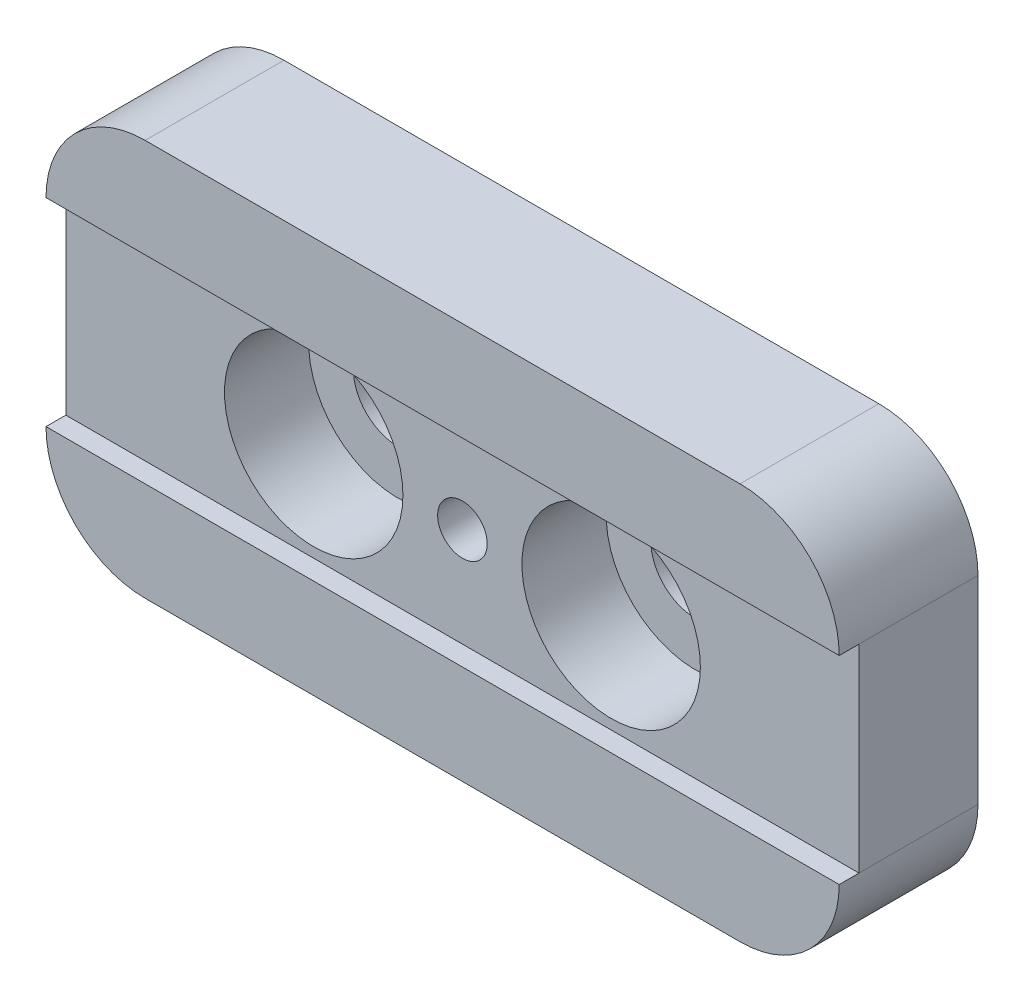
ISO-10303-21;
HEADER;
FILE_DESCRIPTION(('STEP AP214'),'2;1');
FILE_NAME('part.step','',(''),(''),'','','');
FILE_SCHEMA(('AUTOMOTIVE_DESIGN { 1 0 10303 214 1 1 1 1 }'));
ENDSEC;
DATA;
#1=APPLICATION_CONTEXT('core data for automotive mechanical design processes');
#2=APPLICATION_PROTOCOL_DEFINITION('international standard','automotive_design',2000,#1);
#3=PRODUCT_CONTEXT('',#1,'mechanical');
#4=PRODUCT('Part','Part','',(#3));
#5=PRODUCT_RELATED_PRODUCT_CATEGORY('part','',(#4));
#6=PRODUCT_DEFINITION_FORMATION('','',#4);
#7=PRODUCT_DEFINITION_CONTEXT('part definition',#1,'design');
#8=PRODUCT_DEFINITION('design','',#6,#7);
#9=PRODUCT_DEFINITION_SHAPE('','',#8);
#10=(LENGTH_UNIT() NAMED_UNIT(*) SI_UNIT(.MILLI.,.METRE.));
#11=(NAMED_UNIT(*) PLANE_ANGLE_UNIT() SI_UNIT($,.RADIAN.));
#12=(NAMED_UNIT(*) SI_UNIT($,.STERADIAN.) SOLID_ANGLE_UNIT());
#13=UNCERTAINTY_MEASURE_WITH_UNIT(LENGTH_MEASURE(1.E-05),#10,'distance_accuracy_value','');
#14=(GEOMETRIC_REPRESENTATION_CONTEXT(3) GLOBAL_UNCERTAINTY_ASSIGNED_CONTEXT((#13)) GLOBAL_UNIT_ASSIGNED_CONTEXT((#10,
#11,#12)) REPRESENTATION_CONTEXT('',''));
#15=CARTESIAN_POINT('',(0.,0.,0.));
#16=DIRECTION('',(0.,0.,1.));
#17=DIRECTION('',(1.,0.,0.));
#18=AXIS2_PLACEMENT_3D('',#15,#16,#17);
#19=CARTESIAN_POINT('',(40.,20.,14.));
#20=DIRECTION('',(0.,0.,-1.));
#21=DIRECTION('',(-1.,0.,0.));
#22=AXIS2_PLACEMENT_3D('',#19,#20,#21);
#23=PLANE('',#22);
#24=DIRECTION('',(1.,0.,0.));
#25=VECTOR('',#24,1.);
#26=CARTESIAN_POINT('',(-40.,-20.,14.));
#27=LINE('',#26,#25);
#28=CARTESIAN_POINT('',(-30.,-20.,14.));
#29=VERTEX_POINT('',#28);
#30=CARTESIAN_POINT('',(30.,-20.,14.));
#31=VERTEX_POINT('',#30);
#32=EDGE_CURVE('E158',#29,#31,#27,.T.);
#33=ORIENTED_EDGE('',*,*,#32,.T.);
#34=CARTESIAN_POINT('',(30.,-10.,14.));
#35=DIRECTION('',(0.,0.,-1.));
#36=DIRECTION('',(-1.,0.,0.));
#37=AXIS2_PLACEMENT_3D('',#34,#35,#36);
#38=CIRCLE('',#37,10.);
#39=CARTESIAN_POINT('',(40.,-10.,14.));
#40=VERTEX_POINT('',#39);
#41=EDGE_CURVE('E11',#31,#40,#38,.F.);
#42=ORIENTED_EDGE('',*,*,#41,.T.);
#43=DIRECTION('',(1.,0.,0.));
#44=VECTOR('',#43,1.);
#45=CARTESIAN_POINT('',(-40.,-10.,14.));
#46=LINE('',#45,#44);
#47=CARTESIAN_POINT('',(-40.,-10.,14.));
#48=VERTEX_POINT('',#47);
#49=EDGE_CURVE('E143',#48,#40,#46,.T.);
#50=ORIENTED_EDGE('',*,*,#49,.F.);
#51=CARTESIAN_POINT('',(-30.,-10.,14.));
#52=DIRECTION('',(0.,0.,-1.));
#53=DIRECTION('',(-1.,0.,0.));
#54=AXIS2_PLACEMENT_3D('',#51,#52,#53);
#55=CIRCLE('',#54,10.);
#56=EDGE_CURVE('E42',#48,#29,#55,.F.);
#57=ORIENTED_EDGE('',*,*,#56,.T.);
#58=EDGE_LOOP('',(#33,#42,#50,#57));
#59=FACE_BOUND('',#58,.T.);
#60=ADVANCED_FACE('F34',(#59),#23,.F.);
#61=CARTESIAN_POINT('',(40.,-20.,14.));
#62=DIRECTION('',(-1.,0.,0.));
#63=DIRECTION('',(0.,0.,1.));
#64=AXIS2_PLACEMENT_3D('',#61,#62,#63);
#65=PLANE('',#64);
#66=DIRECTION('',(0.,1.,0.));
#67=VECTOR('',#66,1.);
#68=CARTESIAN_POINT('',(40.,-20.,0.));
#69=LINE('',#68,#67);
#70=CARTESIAN_POINT('',(40.,-10.,0.));
#71=VERTEX_POINT('',#70);
#72=CARTESIAN_POINT('',(40.,9.99999999999999,0.));
#73=VERTEX_POINT('',#72);
#74=EDGE_CURVE('E118',#71,#73,#69,.T.);
#75=ORIENTED_EDGE('',*,*,#74,.T.);
#76=DIRECTION('',(0.,0.,-1.));
#77=VECTOR('',#76,1.);
#78=CARTESIAN_POINT('',(40.,9.99999999999999,14.));
#79=LINE('',#78,#77);
#80=CARTESIAN_POINT('',(40.,10.,12.));
#81=VERTEX_POINT('',#80);
#82=EDGE_CURVE('E112',#73,#81,#79,.F.);
#83=ORIENTED_EDGE('',*,*,#82,.T.);
#84=DIRECTION('',(0.,1.,0.));
#85=VECTOR('',#84,1.);
#86=CARTESIAN_POINT('',(40.,-10.,12.));
#87=LINE('',#86,#85);
#88=CARTESIAN_POINT('',(40.,-10.,12.));
#89=VERTEX_POINT('',#88);
#90=EDGE_CURVE('E116',#89,#81,#87,.T.);
#91=ORIENTED_EDGE('',*,*,#90,.F.);
#92=DIRECTION('',(0.,0.,-1.));
#93=VECTOR('',#92,1.);
#94=CARTESIAN_POINT('',(40.,-10.,14.));
#95=LINE('',#94,#93);
#96=EDGE_CURVE('E122',#89,#71,#95,.T.);
#97=ORIENTED_EDGE('',*,*,#96,.T.);
#98=EDGE_LOOP('',(#75,#83,#91,#97));
#99=FACE_BOUND('',#98,.T.);
#100=ADVANCED_FACE('F114',(#99),#65,.F.);
#101=CARTESIAN_POINT('',(-40.,20.,14.));
#102=DIRECTION('',(0.,-1.,0.));
#103=DIRECTION('',(0.,0.,-1.));
#104=AXIS2_PLACEMENT_3D('',#101,#102,#103);
#105=PLANE('',#104);
#106=DIRECTION('',(-1.,0.,0.));
#107=VECTOR('',#106,1.);
#108=CARTESIAN_POINT('',(-40.,20.,0.));
#109=LINE('',#108,#107);
#110=CARTESIAN_POINT('',(30.,20.,0.));
#111=VERTEX_POINT('',#110);
#112=CARTESIAN_POINT('',(-30.,20.,0.));
#113=VERTEX_POINT('',#112);
#114=EDGE_CURVE('E163',#111,#113,#109,.T.);
#115=ORIENTED_EDGE('',*,*,#114,.T.);
#116=DIRECTION('',(0.,0.,-1.));
#117=VECTOR('',#116,1.);
#118=CARTESIAN_POINT('',(-30.,20.,14.));
#119=LINE('',#118,#117);
#120=CARTESIAN_POINT('',(-30.,20.,14.));
#121=VERTEX_POINT('',#120);
#122=EDGE_CURVE('E185',#113,#121,#119,.F.);
#123=ORIENTED_EDGE('',*,*,#122,.T.);
#124=DIRECTION('',(-1.,0.,0.));
#125=VECTOR('',#124,1.);
#126=CARTESIAN_POINT('',(-40.,20.,14.));
#127=LINE('',#126,#125);
#128=CARTESIAN_POINT('',(30.,20.,14.));
#129=VERTEX_POINT('',#128);
#130=EDGE_CURVE('E155',#129,#121,#127,.T.);
#131=ORIENTED_EDGE('',*,*,#130,.F.);
#132=DIRECTION('',(0.,0.,-1.));
#133=VECTOR('',#132,1.);
#134=CARTESIAN_POINT('',(30.,20.,14.));
#135=LINE('',#134,#133);
#136=EDGE_CURVE('E182',#129,#111,#135,.T.);
#137=ORIENTED_EDGE('',*,*,#136,.T.);
#138=EDGE_LOOP('',(#115,#123,#131,#137));
#139=FACE_BOUND('',#138,.T.);
#140=ADVANCED_FACE('F273',(#139),#105,.F.);
#141=CARTESIAN_POINT('',(-40.,-20.,14.));
#142=DIRECTION('',(1.,0.,0.));
#143=DIRECTION('',(0.,0.,-1.));
#144=AXIS2_PLACEMENT_3D('',#141,#142,#143);
#145=PLANE('',#144);
#146=DIRECTION('',(0.,-1.,0.));
#147=VECTOR('',#146,1.);
#148=CARTESIAN_POINT('',(-40.,-10.,12.));
#149=LINE('',#148,#147);
#150=CARTESIAN_POINT('',(-40.,10.,12.));
#151=VERTEX_POINT('',#150);
#152=CARTESIAN_POINT('',(-40.,-10.,12.));
#153=VERTEX_POINT('',#152);
#154=EDGE_CURVE('E137',#151,#153,#149,.T.);
#155=ORIENTED_EDGE('',*,*,#154,.F.);
#156=DIRECTION('',(0.,0.,-1.));
#157=VECTOR('',#156,1.);
#158=CARTESIAN_POINT('',(-40.,9.99999999999999,14.));
#159=LINE('',#158,#157);
#160=CARTESIAN_POINT('',(-40.,9.99999999999999,0.));
#161=VERTEX_POINT('',#160);
#162=EDGE_CURVE('E172',#151,#161,#159,.T.);
#163=ORIENTED_EDGE('',*,*,#162,.T.);
#164=DIRECTION('',(0.,-1.,0.));
#165=VECTOR('',#164,1.);
#166=CARTESIAN_POINT('',(-40.,-20.,0.));
#167=LINE('',#166,#165);
#168=CARTESIAN_POINT('',(-40.,-10.,0.));
#169=VERTEX_POINT('',#168);
#170=EDGE_CURVE('E167',#161,#169,#167,.T.);
#171=ORIENTED_EDGE('',*,*,#170,.T.);
#172=DIRECTION('',(0.,0.,-1.));
#173=VECTOR('',#172,1.);
#174=CARTESIAN_POINT('',(-40.,-10.,14.));
#175=LINE('',#174,#173);
#176=EDGE_CURVE('E161',#169,#153,#175,.F.);
#177=ORIENTED_EDGE('',*,*,#176,.T.);
#178=EDGE_LOOP('',(#155,#163,#171,#177));
#179=FACE_BOUND('',#178,.T.);
#180=ADVANCED_FACE('F284',(#179),#145,.F.);
#181=CARTESIAN_POINT('',(-40.,-20.,14.));
#182=DIRECTION('',(0.,1.,0.));
#183=DIRECTION('',(0.,0.,1.));
#184=AXIS2_PLACEMENT_3D('',#181,#182,#183);
#185=PLANE('',#184);
#186=DIRECTION('',(1.,0.,0.));
#187=VECTOR('',#186,1.);
#188=CARTESIAN_POINT('',(-40.,-20.,0.));
#189=LINE('',#188,#187);
#190=CARTESIAN_POINT('',(-30.,-20.,0.));
#191=VERTEX_POINT('',#190);
#192=CARTESIAN_POINT('',(30.,-20.,0.));
#193=VERTEX_POINT('',#192);
#194=EDGE_CURVE('E159',#191,#193,#189,.T.);
#195=ORIENTED_EDGE('',*,*,#194,.T.);
#196=DIRECTION('',(0.,0.,-1.));
#197=VECTOR('',#196,1.);
#198=CARTESIAN_POINT('',(30.,-20.,14.));
#199=LINE('',#198,#197);
#200=EDGE_CURVE('E49',#193,#31,#199,.F.);
#201=ORIENTED_EDGE('',*,*,#200,.T.);
#202=ORIENTED_EDGE('',*,*,#32,.F.);
#203=DIRECTION('',(0.,0.,-1.));
#204=VECTOR('',#203,1.);
#205=CARTESIAN_POINT('',(-30.,-20.,14.));
#206=LINE('',#205,#204);
#207=EDGE_CURVE('E121',#29,#191,#206,.T.);
#208=ORIENTED_EDGE('',*,*,#207,.T.);
#209=EDGE_LOOP('',(#195,#201,#202,#208));
#210=FACE_BOUND('',#209,.T.);
#211=ADVANCED_FACE('F195',(#210),#185,.F.);
#212=ORIENTED_EDGE('',*,*,#130,.T.);
#213=CARTESIAN_POINT('',(-30.,9.99999999999999,14.));
#214=DIRECTION('',(0.,0.,-1.));
#215=DIRECTION('',(-1.,0.,0.));
#216=AXIS2_PLACEMENT_3D('',#213,#214,#215);
#217=CIRCLE('',#216,10.);
#218=CARTESIAN_POINT('',(-40.,10.,14.));
#219=VERTEX_POINT('',#218);
#220=EDGE_CURVE('E188',#121,#219,#217,.F.);
#221=ORIENTED_EDGE('',*,*,#220,.T.);
#222=DIRECTION('',(-1.,0.,0.));
#223=VECTOR('',#222,1.);
#224=CARTESIAN_POINT('',(-40.,10.,14.));
#225=LINE('',#224,#223);
#226=CARTESIAN_POINT('',(40.,10.,14.));
#227=VERTEX_POINT('',#226);
#228=EDGE_CURVE('E210',#227,#219,#225,.T.);
#229=ORIENTED_EDGE('',*,*,#228,.F.);
#230=CARTESIAN_POINT('',(30.,9.99999999999999,14.));
#231=DIRECTION('',(0.,0.,-1.));
#232=DIRECTION('',(-1.,0.,0.));
#233=AXIS2_PLACEMENT_3D('',#230,#231,#232);
#234=CIRCLE('',#233,10.);
#235=EDGE_CURVE('E148',#227,#129,#234,.F.);
#236=ORIENTED_EDGE('',*,*,#235,.T.);
#237=EDGE_LOOP('',(#212,#221,#229,#236));
#238=FACE_BOUND('',#237,.T.);
#239=ADVANCED_FACE('F269',(#238),#23,.F.);
#240=CARTESIAN_POINT('',(40.,20.,0.));
#241=DIRECTION('',(0.,0.,-1.));
#242=DIRECTION('',(-1.,0.,0.));
#243=AXIS2_PLACEMENT_3D('',#240,#241,#242);
#244=PLANE('',#243);
#245=CARTESIAN_POINT('',(-15.,0.,-4.52762827229947E-13));
#246=DIRECTION('',(0.,0.,1.));
#247=DIRECTION('',(1.,0.,0.));
#248=AXIS2_PLACEMENT_3D('',#245,#246,#247);
#249=CIRCLE('',#248,4.5);
#250=CARTESIAN_POINT('',(-10.5,0.,-4.52762827229947E-13));
#251=VERTEX_POINT('',#250);
#252=EDGE_CURVE('E234',#251,#251,#249,.T.);
#253=ORIENTED_EDGE('',*,*,#252,.T.);
#254=EDGE_LOOP('',(#253));
#255=FACE_BOUND('',#254,.T.);
#256=CARTESIAN_POINT('',(15.,0.,-4.52762827229947E-13));
#257=DIRECTION('',(0.,0.,1.));
#258=DIRECTION('',(1.,0.,0.));
#259=AXIS2_PLACEMENT_3D('',#256,#257,#258);
#260=CIRCLE('',#259,4.5);
#261=CARTESIAN_POINT('',(19.5,0.,-4.52762827229947E-13));
#262=VERTEX_POINT('',#261);
#263=EDGE_CURVE('E222',#262,#262,#260,.T.);
#264=ORIENTED_EDGE('',*,*,#263,.T.);
#265=EDGE_LOOP('',(#264));
#266=FACE_BOUND('',#265,.T.);
#267=CARTESIAN_POINT('',(0.,0.,0.));
#268=DIRECTION('',(0.,0.,-1.));
#269=DIRECTION('',(-1.,0.,0.));
#270=AXIS2_PLACEMENT_3D('',#267,#268,#269);
#271=CIRCLE('',#270,2.5);
#272=CARTESIAN_POINT('',(-2.5,0.,0.));
#273=VERTEX_POINT('',#272);
#274=EDGE_CURVE('E212',#273,#273,#271,.T.);
#275=ORIENTED_EDGE('',*,*,#274,.F.);
#276=EDGE_LOOP('',(#275));
#277=FACE_BOUND('',#276,.T.);
#278=ORIENTED_EDGE('',*,*,#170,.F.);
#279=CARTESIAN_POINT('',(-30.,9.99999999999999,0.));
#280=DIRECTION('',(0.,0.,-1.));
#281=DIRECTION('',(-1.,0.,0.));
#282=AXIS2_PLACEMENT_3D('',#279,#280,#281);
#283=CIRCLE('',#282,10.);
#284=EDGE_CURVE('E180',#161,#113,#283,.T.);
#285=ORIENTED_EDGE('',*,*,#284,.T.);
#286=ORIENTED_EDGE('',*,*,#114,.F.);
#287=CARTESIAN_POINT('',(30.,9.99999999999999,0.));
#288=DIRECTION('',(0.,0.,-1.));
#289=DIRECTION('',(-1.,0.,0.));
#290=AXIS2_PLACEMENT_3D('',#287,#288,#289);
#291=CIRCLE('',#290,10.);
#292=EDGE_CURVE('E178',#111,#73,#291,.T.);
#293=ORIENTED_EDGE('',*,*,#292,.T.);
#294=ORIENTED_EDGE('',*,*,#74,.F.);
#295=CARTESIAN_POINT('',(30.,-10.,0.));
#296=DIRECTION('',(0.,0.,-1.));
#297=DIRECTION('',(-1.,0.,0.));
#298=AXIS2_PLACEMENT_3D('',#295,#296,#297);
#299=CIRCLE('',#298,10.);
#300=EDGE_CURVE('E176',#71,#193,#299,.T.);
#301=ORIENTED_EDGE('',*,*,#300,.T.);
#302=ORIENTED_EDGE('',*,*,#194,.F.);
#303=CARTESIAN_POINT('',(-30.,-10.,0.));
#304=DIRECTION('',(0.,0.,-1.));
#305=DIRECTION('',(-1.,0.,0.));
#306=AXIS2_PLACEMENT_3D('',#303,#304,#305);
#307=CIRCLE('',#306,10.);
#308=EDGE_CURVE('E174',#191,#169,#307,.T.);
#309=ORIENTED_EDGE('',*,*,#308,.T.);
#310=EDGE_LOOP('',(#278,#285,#286,#293,#294,#301,#302,#309));
#311=FACE_BOUND('',#310,.T.);
#312=ADVANCED_FACE('F199',(#255,#266,#277,#311),#244,.T.);
#313=CARTESIAN_POINT('',(-40.,-10.,12.));
#314=DIRECTION('',(0.,-1.,0.));
#315=DIRECTION('',(0.,0.,-1.));
#316=AXIS2_PLACEMENT_3D('',#313,#314,#315);
#317=PLANE('',#316);
#318=ORIENTED_EDGE('',*,*,#49,.T.);
#319=DIRECTION('',(0.,0.,1.));
#320=VECTOR('',#319,1.);
#321=CARTESIAN_POINT('',(40.,-10.,12.));
#322=LINE('',#321,#320);
#323=EDGE_CURVE('E164',#89,#40,#322,.T.);
#324=ORIENTED_EDGE('',*,*,#323,.F.);
#325=DIRECTION('',(1.,0.,0.));
#326=VECTOR('',#325,1.);
#327=CARTESIAN_POINT('',(-40.,-10.,12.));
#328=LINE('',#327,#326);
#329=EDGE_CURVE('E142',#153,#89,#328,.T.);
#330=ORIENTED_EDGE('',*,*,#329,.F.);
#331=DIRECTION('',(0.,0.,1.));
#332=VECTOR('',#331,1.);
#333=CARTESIAN_POINT('',(-40.,-10.,12.));
#334=LINE('',#333,#332);
#335=EDGE_CURVE('E150',#153,#48,#334,.T.);
#336=ORIENTED_EDGE('',*,*,#335,.T.);
#337=EDGE_LOOP('',(#318,#324,#330,#336));
#338=FACE_BOUND('',#337,.T.);
#339=ADVANCED_FACE('F208',(#338),#317,.F.);
#340=CARTESIAN_POINT('',(-40.,10.,12.));
#341=DIRECTION('',(0.,1.,0.));
#342=DIRECTION('',(0.,0.,1.));
#343=AXIS2_PLACEMENT_3D('',#340,#341,#342);
#344=PLANE('',#343);
#345=ORIENTED_EDGE('',*,*,#228,.T.);
#346=DIRECTION('',(0.,0.,1.));
#347=VECTOR('',#346,1.);
#348=CARTESIAN_POINT('',(-40.,10.,12.));
#349=LINE('',#348,#347);
#350=EDGE_CURVE('E133',#151,#219,#349,.T.);
#351=ORIENTED_EDGE('',*,*,#350,.F.);
#352=DIRECTION('',(-1.,0.,0.));
#353=VECTOR('',#352,1.);
#354=CARTESIAN_POINT('',(-40.,10.,12.));
#355=LINE('',#354,#353);
#356=EDGE_CURVE('E127',#81,#151,#355,.T.);
#357=ORIENTED_EDGE('',*,*,#356,.F.);
#358=DIRECTION('',(0.,0.,1.));
#359=VECTOR('',#358,1.);
#360=CARTESIAN_POINT('',(40.,10.,12.));
#361=LINE('',#360,#359);
#362=EDGE_CURVE('E130',#81,#227,#361,.T.);
#363=ORIENTED_EDGE('',*,*,#362,.T.);
#364=EDGE_LOOP('',(#345,#351,#357,#363));
#365=FACE_BOUND('',#364,.T.);
#366=ADVANCED_FACE('F129',(#365),#344,.F.);
#367=CARTESIAN_POINT('',(40.,10.,12.));
#368=DIRECTION('',(0.,0.,-1.));
#369=DIRECTION('',(-1.,0.,0.));
#370=AXIS2_PLACEMENT_3D('',#367,#368,#369);
#371=PLANE('',#370);
#372=CARTESIAN_POINT('',(-15.,0.,12.));
#373=DIRECTION('',(0.,0.,1.));
#374=DIRECTION('',(1.,0.,0.));
#375=AXIS2_PLACEMENT_3D('',#372,#373,#374);
#376=CIRCLE('',#375,9.);
#377=CARTESIAN_POINT('',(-6.,0.,12.));
#378=VERTEX_POINT('',#377);
#379=EDGE_CURVE('E243',#378,#378,#376,.T.);
#380=ORIENTED_EDGE('',*,*,#379,.F.);
#381=EDGE_LOOP('',(#380));
#382=FACE_BOUND('',#381,.T.);
#383=CARTESIAN_POINT('',(15.,0.,12.));
#384=DIRECTION('',(0.,0.,1.));
#385=DIRECTION('',(1.,0.,0.));
#386=AXIS2_PLACEMENT_3D('',#383,#384,#385);
#387=CIRCLE('',#386,9.);
#388=CARTESIAN_POINT('',(24.,0.,12.));
#389=VERTEX_POINT('',#388);
#390=EDGE_CURVE('E231',#389,#389,#387,.T.);
#391=ORIENTED_EDGE('',*,*,#390,.F.);
#392=EDGE_LOOP('',(#391));
#393=FACE_BOUND('',#392,.T.);
#394=CARTESIAN_POINT('',(0.,0.,12.));
#395=DIRECTION('',(0.,0.,1.));
#396=DIRECTION('',(1.,0.,0.));
#397=AXIS2_PLACEMENT_3D('',#394,#395,#396);
#398=CIRCLE('',#397,2.5);
#399=CARTESIAN_POINT('',(2.5,0.,12.));
#400=VERTEX_POINT('',#399);
#401=EDGE_CURVE('E219',#400,#400,#398,.T.);
#402=ORIENTED_EDGE('',*,*,#401,.F.);
#403=EDGE_LOOP('',(#402));
#404=FACE_BOUND('',#403,.T.);
#405=ORIENTED_EDGE('',*,*,#90,.T.);
#406=ORIENTED_EDGE('',*,*,#356,.T.);
#407=ORIENTED_EDGE('',*,*,#154,.T.);
#408=ORIENTED_EDGE('',*,*,#329,.T.);
#409=EDGE_LOOP('',(#405,#406,#407,#408));
#410=FACE_BOUND('',#409,.T.);
#411=ADVANCED_FACE('F140',(#382,#393,#404,#410),#371,.F.);
#412=CARTESIAN_POINT('',(0.,0.,12.));
#413=DIRECTION('',(0.,0.,1.));
#414=DIRECTION('',(1.,0.,0.));
#415=AXIS2_PLACEMENT_3D('',#412,#413,#414);
#416=CYLINDRICAL_SURFACE('',#415,2.5);
#417=ORIENTED_EDGE('',*,*,#274,.T.);
#418=EDGE_LOOP('',(#417));
#419=FACE_BOUND('',#418,.T.);
#420=ORIENTED_EDGE('',*,*,#401,.T.);
#421=EDGE_LOOP('',(#420));
#422=FACE_BOUND('',#421,.T.);
#423=ADVANCED_FACE('F251',(#419,#422),#416,.F.);
#424=CARTESIAN_POINT('',(15.,0.,12.));
#425=DIRECTION('',(0.,0.,1.));
#426=DIRECTION('',(1.,0.,0.));
#427=AXIS2_PLACEMENT_3D('',#424,#425,#426);
#428=CYLINDRICAL_SURFACE('',#427,4.5);
#429=ORIENTED_EDGE('',*,*,#263,.F.);
#430=EDGE_LOOP('',(#429));
#431=FACE_BOUND('',#430,.T.);
#432=CARTESIAN_POINT('',(15.,0.,3.5));
#433=DIRECTION('',(0.,0.,1.));
#434=DIRECTION('',(1.,0.,0.));
#435=AXIS2_PLACEMENT_3D('',#432,#433,#434);
#436=CIRCLE('',#435,4.5);
#437=CARTESIAN_POINT('',(19.5,0.,3.5));
#438=VERTEX_POINT('',#437);
#439=EDGE_CURVE('E225',#438,#438,#436,.T.);
#440=ORIENTED_EDGE('',*,*,#439,.T.);
#441=EDGE_LOOP('',(#440));
#442=FACE_BOUND('',#441,.T.);
#443=ADVANCED_FACE('F258',(#431,#442),#428,.F.);
#444=CARTESIAN_POINT('',(19.5,0.,3.5));
#445=DIRECTION('',(0.,0.,-1.));
#446=DIRECTION('',(-1.,0.,0.));
#447=AXIS2_PLACEMENT_3D('',#444,#445,#446);
#448=PLANE('',#447);
#449=ORIENTED_EDGE('',*,*,#439,.F.);
#450=EDGE_LOOP('',(#449));
#451=FACE_BOUND('',#450,.T.);
#452=CARTESIAN_POINT('',(15.,0.,3.5));
#453=DIRECTION('',(0.,0.,1.));
#454=DIRECTION('',(1.,0.,0.));
#455=AXIS2_PLACEMENT_3D('',#452,#453,#454);
#456=CIRCLE('',#455,9.);
#457=CARTESIAN_POINT('',(24.,0.,3.5));
#458=VERTEX_POINT('',#457);
#459=EDGE_CURVE('E228',#458,#458,#456,.T.);
#460=ORIENTED_EDGE('',*,*,#459,.T.);
#461=EDGE_LOOP('',(#460));
#462=FACE_BOUND('',#461,.T.);
#463=ADVANCED_FACE('F264',(#451,#462),#448,.F.);
#464=CARTESIAN_POINT('',(15.,0.,12.));
#465=DIRECTION('',(0.,0.,1.));
#466=DIRECTION('',(1.,0.,0.));
#467=AXIS2_PLACEMENT_3D('',#464,#465,#466);
#468=CYLINDRICAL_SURFACE('',#467,9.);
#469=ORIENTED_EDGE('',*,*,#459,.F.);
#470=EDGE_LOOP('',(#469));
#471=FACE_BOUND('',#470,.T.);
#472=ORIENTED_EDGE('',*,*,#390,.T.);
#473=EDGE_LOOP('',(#472));
#474=FACE_BOUND('',#473,.T.);
#475=ADVANCED_FACE('F415',(#471,#474),#468,.F.);
#476=CARTESIAN_POINT('',(-15.,0.,12.));
#477=DIRECTION('',(0.,0.,1.));
#478=DIRECTION('',(1.,0.,0.));
#479=AXIS2_PLACEMENT_3D('',#476,#477,#478);
#480=CYLINDRICAL_SURFACE('',#479,4.5);
#481=ORIENTED_EDGE('',*,*,#252,.F.);
#482=EDGE_LOOP('',(#481));
#483=FACE_BOUND('',#482,.T.);
#484=CARTESIAN_POINT('',(-15.,0.,3.5));
#485=DIRECTION('',(0.,0.,1.));
#486=DIRECTION('',(1.,0.,0.));
#487=AXIS2_PLACEMENT_3D('',#484,#485,#486);
#488=CIRCLE('',#487,4.5);
#489=CARTESIAN_POINT('',(-10.5,0.,3.5));
#490=VERTEX_POINT('',#489);
#491=EDGE_CURVE('E237',#490,#490,#488,.T.);
#492=ORIENTED_EDGE('',*,*,#491,.T.);
#493=EDGE_LOOP('',(#492));
#494=FACE_BOUND('',#493,.T.);
#495=ADVANCED_FACE('F405',(#483,#494),#480,.F.);
#496=CARTESIAN_POINT('',(-10.5,0.,3.5));
#497=DIRECTION('',(0.,0.,-1.));
#498=DIRECTION('',(-1.,0.,0.));
#499=AXIS2_PLACEMENT_3D('',#496,#497,#498);
#500=PLANE('',#499);
#501=ORIENTED_EDGE('',*,*,#491,.F.);
#502=EDGE_LOOP('',(#501));
#503=FACE_BOUND('',#502,.T.);
#504=CARTESIAN_POINT('',(-15.,0.,3.5));
#505=DIRECTION('',(0.,0.,1.));
#506=DIRECTION('',(1.,0.,0.));
#507=AXIS2_PLACEMENT_3D('',#504,#505,#506);
#508=CIRCLE('',#507,9.);
#509=CARTESIAN_POINT('',(-6.,0.,3.5));
#510=VERTEX_POINT('',#509);
#511=EDGE_CURVE('E240',#510,#510,#508,.T.);
#512=ORIENTED_EDGE('',*,*,#511,.T.);
#513=EDGE_LOOP('',(#512));
#514=FACE_BOUND('',#513,.T.);
#515=ADVANCED_FACE('F395',(#503,#514),#500,.F.);
#516=CARTESIAN_POINT('',(-15.,0.,12.));
#517=DIRECTION('',(0.,0.,1.));
#518=DIRECTION('',(1.,0.,0.));
#519=AXIS2_PLACEMENT_3D('',#516,#517,#518);
#520=CYLINDRICAL_SURFACE('',#519,9.);
#521=ORIENTED_EDGE('',*,*,#511,.F.);
#522=EDGE_LOOP('',(#521));
#523=FACE_BOUND('',#522,.T.);
#524=ORIENTED_EDGE('',*,*,#379,.T.);
#525=EDGE_LOOP('',(#524));
#526=FACE_BOUND('',#525,.T.);
#527=ADVANCED_FACE('F247',(#523,#526),#520,.F.);
#528=CARTESIAN_POINT('',(-30.,9.99999999999999,14.));
#529=DIRECTION('',(0.,0.,-1.));
#530=DIRECTION('',(-1.,0.,0.));
#531=AXIS2_PLACEMENT_3D('',#528,#529,#530);
#532=CYLINDRICAL_SURFACE('',#531,10.);
#533=ORIENTED_EDGE('',*,*,#220,.F.);
#534=ORIENTED_EDGE('',*,*,#122,.F.);
#535=ORIENTED_EDGE('',*,*,#284,.F.);
#536=ORIENTED_EDGE('',*,*,#162,.F.);
#537=ORIENTED_EDGE('',*,*,#350,.T.);
#538=EDGE_LOOP('',(#533,#534,#535,#536,#537));
#539=FACE_BOUND('',#538,.T.);
#540=ADVANCED_FACE('F291',(#539),#532,.T.);
#541=CARTESIAN_POINT('',(30.,9.99999999999999,14.));
#542=DIRECTION('',(0.,0.,-1.));
#543=DIRECTION('',(-1.,0.,0.));
#544=AXIS2_PLACEMENT_3D('',#541,#542,#543);
#545=CYLINDRICAL_SURFACE('',#544,10.);
#546=ORIENTED_EDGE('',*,*,#362,.F.);
#547=ORIENTED_EDGE('',*,*,#82,.F.);
#548=ORIENTED_EDGE('',*,*,#292,.F.);
#549=ORIENTED_EDGE('',*,*,#136,.F.);
#550=ORIENTED_EDGE('',*,*,#235,.F.);
#551=EDGE_LOOP('',(#546,#547,#548,#549,#550));
#552=FACE_BOUND('',#551,.T.);
#553=ADVANCED_FACE('F146',(#552),#545,.T.);
#554=CARTESIAN_POINT('',(30.,-10.,14.));
#555=DIRECTION('',(0.,0.,-1.));
#556=DIRECTION('',(-1.,0.,0.));
#557=AXIS2_PLACEMENT_3D('',#554,#555,#556);
#558=CYLINDRICAL_SURFACE('',#557,10.);
#559=ORIENTED_EDGE('',*,*,#41,.F.);
#560=ORIENTED_EDGE('',*,*,#200,.F.);
#561=ORIENTED_EDGE('',*,*,#300,.F.);
#562=ORIENTED_EDGE('',*,*,#96,.F.);
#563=ORIENTED_EDGE('',*,*,#323,.T.);
#564=EDGE_LOOP('',(#559,#560,#561,#562,#563));
#565=FACE_BOUND('',#564,.T.);
#566=ADVANCED_FACE('F203',(#565),#558,.T.);
#567=CARTESIAN_POINT('',(-30.,-10.,14.));
#568=DIRECTION('',(0.,0.,-1.));
#569=DIRECTION('',(-1.,0.,0.));
#570=AXIS2_PLACEMENT_3D('',#567,#568,#569);
#571=CYLINDRICAL_SURFACE('',#570,10.);
#572=ORIENTED_EDGE('',*,*,#335,.F.);
#573=ORIENTED_EDGE('',*,*,#176,.F.);
#574=ORIENTED_EDGE('',*,*,#308,.F.);
#575=ORIENTED_EDGE('',*,*,#207,.F.);
#576=ORIENTED_EDGE('',*,*,#56,.F.);
#577=EDGE_LOOP('',(#572,#573,#574,#575,#576));
#578=FACE_BOUND('',#577,.T.);
#579=ADVANCED_FACE('F36',(#578),#571,.T.);
#580=CLOSED_SHELL('',(#60,#100,#140,#180,#211,#239,#312,#339,#366,#411,#423,#443,#463,#475,#495,
#515,#527,#540,#553,#566,#579));
#581=MANIFOLD_SOLID_BREP('B2',#580);
#582=ADVANCED_BREP_SHAPE_REPRESENTATION('',(#18,#581),#14);
#583=SHAPE_DEFINITION_REPRESENTATION(#9,#582);
ENDSEC;
END-ISO-10303-21;
